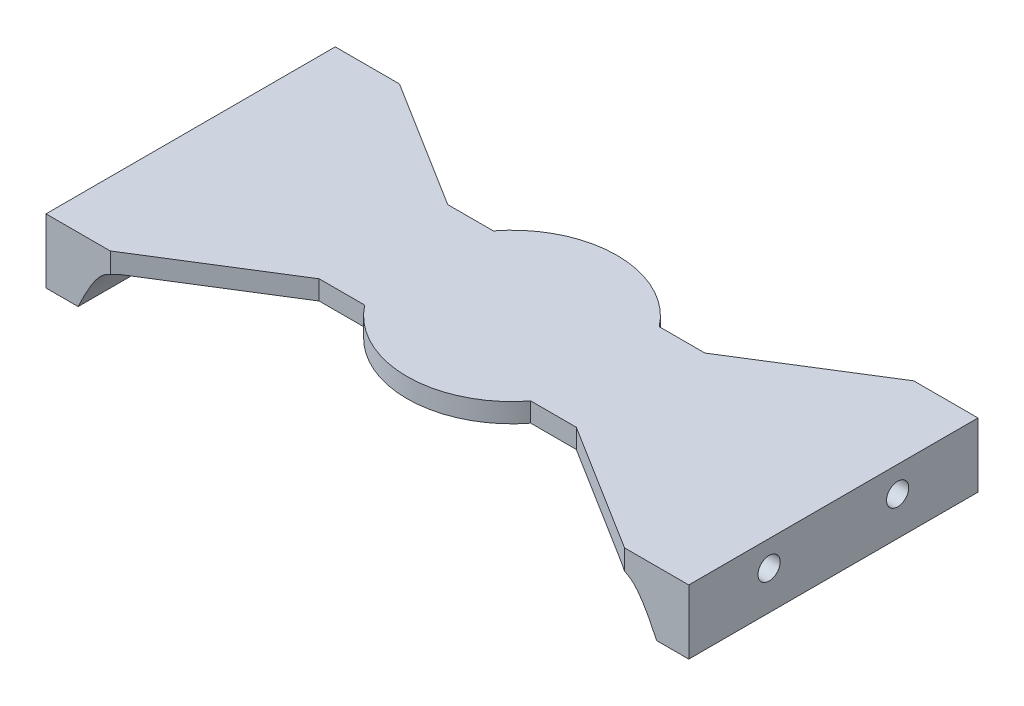
ISO-10303-21;
HEADER;
FILE_DESCRIPTION(('STEP AP214'),'2;1');
FILE_NAME('part.step','',(''),(''),'','','');
FILE_SCHEMA(('AUTOMOTIVE_DESIGN { 1 0 10303 214 1 1 1 1 }'));
ENDSEC;
DATA;
#1=APPLICATION_CONTEXT('core data for automotive mechanical design processes');
#2=APPLICATION_PROTOCOL_DEFINITION('international standard','automotive_design',2000,#1);
#3=PRODUCT_CONTEXT('',#1,'mechanical');
#4=PRODUCT('Part','Part','',(#3));
#5=PRODUCT_RELATED_PRODUCT_CATEGORY('part','',(#4));
#6=PRODUCT_DEFINITION_FORMATION('','',#4);
#7=PRODUCT_DEFINITION_CONTEXT('part definition',#1,'design');
#8=PRODUCT_DEFINITION('design','',#6,#7);
#9=PRODUCT_DEFINITION_SHAPE('','',#8);
#10=(LENGTH_UNIT() NAMED_UNIT(*) SI_UNIT(.MILLI.,.METRE.));
#11=(NAMED_UNIT(*) PLANE_ANGLE_UNIT() SI_UNIT($,.RADIAN.));
#12=(NAMED_UNIT(*) SI_UNIT($,.STERADIAN.) SOLID_ANGLE_UNIT());
#13=UNCERTAINTY_MEASURE_WITH_UNIT(LENGTH_MEASURE(1.E-05),#10,'distance_accuracy_value','');
#14=(GEOMETRIC_REPRESENTATION_CONTEXT(3) GLOBAL_UNCERTAINTY_ASSIGNED_CONTEXT((#13)) GLOBAL_UNIT_ASSIGNED_CONTEXT((#10,
#11,#12)) REPRESENTATION_CONTEXT('',''));
#15=CARTESIAN_POINT('',(0.,0.,0.));
#16=DIRECTION('',(0.,0.,1.));
#17=DIRECTION('',(1.,0.,0.));
#18=AXIS2_PLACEMENT_3D('',#15,#16,#17);
#19=CARTESIAN_POINT('',(20.,3.,9.99999999999999));
#20=DIRECTION('',(0.,0.,-1.));
#21=DIRECTION('',(-1.,0.,0.));
#22=AXIS2_PLACEMENT_3D('',#19,#20,#21);
#23=PLANE('',#22);
#24=DIRECTION('',(1.,0.,0.));
#25=VECTOR('',#24,1.);
#26=CARTESIAN_POINT('',(20.,0.,9.99999999999999));
#27=LINE('',#26,#25);
#28=CARTESIAN_POINT('',(-20.,0.,10.));
#29=VERTEX_POINT('',#28);
#30=CARTESIAN_POINT('',(-12.9126281933398,0.,10.));
#31=VERTEX_POINT('',#30);
#32=EDGE_CURVE('E67',#29,#31,#27,.T.);
#33=ORIENTED_EDGE('',*,*,#32,.T.);
#34=DIRECTION('',(0.,1.,0.));
#35=VECTOR('',#34,1.);
#36=CARTESIAN_POINT('',(-12.9126281933398,-46.1940227180474,10.));
#37=LINE('',#36,#35);
#38=CARTESIAN_POINT('',(-12.9126281933398,3.,10.));
#39=VERTEX_POINT('',#38);
#40=EDGE_CURVE('E223',#31,#39,#37,.T.);
#41=ORIENTED_EDGE('',*,*,#40,.T.);
#42=DIRECTION('',(1.,0.,0.));
#43=VECTOR('',#42,1.);
#44=CARTESIAN_POINT('',(20.,3.,9.99999999999999));
#45=LINE('',#44,#43);
#46=CARTESIAN_POINT('',(-20.,3.,10.));
#47=VERTEX_POINT('',#46);
#48=EDGE_CURVE('E270',#47,#39,#45,.T.);
#49=ORIENTED_EDGE('',*,*,#48,.F.);
#50=DIRECTION('',(0.,-1.,0.));
#51=VECTOR('',#50,1.);
#52=CARTESIAN_POINT('',(-20.,3.,10.));
#53=LINE('',#52,#51);
#54=EDGE_CURVE('E549',#47,#29,#53,.T.);
#55=ORIENTED_EDGE('',*,*,#54,.T.);
#56=EDGE_LOOP('',(#33,#41,#49,#55));
#57=FACE_BOUND('',#56,.T.);
#58=ADVANCED_FACE('F48',(#57),#23,.F.);
#59=CARTESIAN_POINT('',(20.,3.,-10.));
#60=DIRECTION('',(0.,0.,1.));
#61=DIRECTION('',(1.,0.,0.));
#62=AXIS2_PLACEMENT_3D('',#59,#60,#61);
#63=PLANE('',#62);
#64=DIRECTION('',(-1.,0.,0.));
#65=VECTOR('',#64,1.);
#66=CARTESIAN_POINT('',(20.,0.,-10.));
#67=LINE('',#66,#65);
#68=CARTESIAN_POINT('',(20.,0.,-10.));
#69=VERTEX_POINT('',#68);
#70=CARTESIAN_POINT('',(12.9126281933398,0.,-10.));
#71=VERTEX_POINT('',#70);
#72=EDGE_CURVE('E75',#69,#71,#67,.T.);
#73=ORIENTED_EDGE('',*,*,#72,.T.);
#74=DIRECTION('',(0.,1.,0.));
#75=VECTOR('',#74,1.);
#76=CARTESIAN_POINT('',(12.9126281933398,-46.1940227180474,-10.));
#77=LINE('',#76,#75);
#78=CARTESIAN_POINT('',(12.9126281933398,3.,-10.));
#79=VERTEX_POINT('',#78);
#80=EDGE_CURVE('E209',#71,#79,#77,.T.);
#81=ORIENTED_EDGE('',*,*,#80,.T.);
#82=DIRECTION('',(-1.,0.,0.));
#83=VECTOR('',#82,1.);
#84=CARTESIAN_POINT('',(20.,3.,-10.));
#85=LINE('',#84,#83);
#86=CARTESIAN_POINT('',(20.,3.,-10.));
#87=VERTEX_POINT('',#86);
#88=EDGE_CURVE('E283',#87,#79,#85,.T.);
#89=ORIENTED_EDGE('',*,*,#88,.F.);
#90=DIRECTION('',(0.,-1.,0.));
#91=VECTOR('',#90,1.);
#92=CARTESIAN_POINT('',(20.,3.,-10.));
#93=LINE('',#92,#91);
#94=EDGE_CURVE('E535',#87,#69,#93,.T.);
#95=ORIENTED_EDGE('',*,*,#94,.T.);
#96=EDGE_LOOP('',(#73,#81,#89,#95));
#97=FACE_BOUND('',#96,.T.);
#98=ADVANCED_FACE('F690',(#97),#63,.F.);
#99=CARTESIAN_POINT('',(50.,3.,-22.5));
#100=DIRECTION('',(-1.,0.,0.));
#101=DIRECTION('',(0.,0.,1.));
#102=AXIS2_PLACEMENT_3D('',#99,#100,#101);
#103=PLANE('',#102);
#104=CARTESIAN_POINT('',(50.,-1.,10.));
#105=DIRECTION('',(-1.,0.,0.));
#106=DIRECTION('',(0.,0.,1.));
#107=AXIS2_PLACEMENT_3D('',#104,#105,#106);
#108=CIRCLE('',#107,1.725);
#109=CARTESIAN_POINT('',(50.,-1.,11.725));
#110=VERTEX_POINT('',#109);
#111=EDGE_CURVE('E225',#110,#110,#108,.F.);
#112=ORIENTED_EDGE('',*,*,#111,.F.);
#113=EDGE_LOOP('',(#112));
#114=FACE_BOUND('',#113,.T.);
#115=DIRECTION('',(0.,-1.,0.));
#116=VECTOR('',#115,1.);
#117=CARTESIAN_POINT('',(50.,3.,22.5));
#118=LINE('',#117,#116);
#119=CARTESIAN_POINT('',(50.,3.,22.5));
#120=VERTEX_POINT('',#119);
#121=CARTESIAN_POINT('',(50.,-7.,22.5));
#122=VERTEX_POINT('',#121);
#123=EDGE_CURVE('E531',#120,#122,#118,.T.);
#124=ORIENTED_EDGE('',*,*,#123,.T.);
#125=DIRECTION('',(0.,0.,1.));
#126=VECTOR('',#125,1.);
#127=CARTESIAN_POINT('',(50.,-7.,0.));
#128=LINE('',#127,#126);
#129=CARTESIAN_POINT('',(50.,-7.,-22.5));
#130=VERTEX_POINT('',#129);
#131=EDGE_CURVE('E229',#130,#122,#128,.T.);
#132=ORIENTED_EDGE('',*,*,#131,.F.);
#133=DIRECTION('',(0.,-1.,0.));
#134=VECTOR('',#133,1.);
#135=CARTESIAN_POINT('',(50.,3.,-22.5));
#136=LINE('',#135,#134);
#137=CARTESIAN_POINT('',(50.,3.,-22.5));
#138=VERTEX_POINT('',#137);
#139=EDGE_CURVE('E534',#138,#130,#136,.T.);
#140=ORIENTED_EDGE('',*,*,#139,.F.);
#141=DIRECTION('',(0.,0.,-1.));
#142=VECTOR('',#141,1.);
#143=CARTESIAN_POINT('',(50.,3.,-22.5));
#144=LINE('',#143,#142);
#145=EDGE_CURVE('E277',#120,#138,#144,.T.);
#146=ORIENTED_EDGE('',*,*,#145,.F.);
#147=EDGE_LOOP('',(#124,#132,#140,#146));
#148=FACE_BOUND('',#147,.T.);
#149=CARTESIAN_POINT('',(50.,-1.,-9.99999999999999));
#150=DIRECTION('',(-1.,0.,0.));
#151=DIRECTION('',(0.,0.,1.));
#152=AXIS2_PLACEMENT_3D('',#149,#150,#151);
#153=CIRCLE('',#152,1.725);
#154=CARTESIAN_POINT('',(50.,-1.,-8.27499999999999));
#155=VERTEX_POINT('',#154);
#156=EDGE_CURVE('E230',#155,#155,#153,.T.);
#157=ORIENTED_EDGE('',*,*,#156,.T.);
#158=EDGE_LOOP('',(#157));
#159=FACE_BOUND('',#158,.T.);
#160=ADVANCED_FACE('F320',(#114,#148,#159),#103,.F.);
#161=CARTESIAN_POINT('',(0.,0.,0.));
#162=DIRECTION('',(0.,1.,0.));
#163=DIRECTION('',(0.,0.,1.));
#164=AXIS2_PLACEMENT_3D('',#161,#162,#163);
#165=PLANE('',#164);
#166=CARTESIAN_POINT('',(-12.9126281933398,0.,-10.));
#167=VERTEX_POINT('',#166);
#168=CARTESIAN_POINT('',(-20.,0.,-10.));
#169=VERTEX_POINT('',#168);
#170=EDGE_CURVE('E190',#167,#169,#67,.T.);
#171=ORIENTED_EDGE('',*,*,#170,.F.);
#172=CARTESIAN_POINT('',(0.,0.,0.));
#173=DIRECTION('',(0.,1.,0.));
#174=DIRECTION('',(0.,0.,1.));
#175=AXIS2_PLACEMENT_3D('',#172,#173,#174);
#176=CIRCLE('',#175,16.3320533571084);
#177=EDGE_CURVE('E194',#167,#71,#176,.F.);
#178=ORIENTED_EDGE('',*,*,#177,.T.);
#179=ORIENTED_EDGE('',*,*,#72,.F.);
#180=DIRECTION('',(-0.847998304005088,0.,0.52999894000318));
#181=VECTOR('',#180,1.);
#182=CARTESIAN_POINT('',(20.,0.,-10.));
#183=LINE('',#182,#181);
#184=CARTESIAN_POINT('',(38.6754446796632,0.,-21.6721529247895));
#185=VERTEX_POINT('',#184);
#186=EDGE_CURVE('E200',#185,#69,#183,.T.);
#187=ORIENTED_EDGE('',*,*,#186,.F.);
#188=CARTESIAN_POINT('',(38.6754446796632,0.,24.75));
#189=CARTESIAN_POINT('',(38.6754446796632,0.,8.25000000000001));
#190=CARTESIAN_POINT('',(38.6754446796632,0.,-8.25));
#191=CARTESIAN_POINT('',(38.6754446796632,0.,-24.75));
#192=B_SPLINE_CURVE_WITH_KNOTS('',3,(#188,#189,#190,#191),.UNSPECIFIED.,.F.,.F.,(4,4),(-0.02475,
0.02475),.UNSPECIFIED.);
#193=CARTESIAN_POINT('',(38.6754446796632,0.,21.6721529247895));
#194=VERTEX_POINT('',#193);
#195=EDGE_CURVE('E608',#185,#194,#192,.F.);
#196=ORIENTED_EDGE('',*,*,#195,.T.);
#197=DIRECTION('',(0.847998304005088,0.,0.52999894000318));
#198=VECTOR('',#197,1.);
#199=CARTESIAN_POINT('',(20.,0.,9.99999999999999));
#200=LINE('',#199,#198);
#201=CARTESIAN_POINT('',(20.,0.,9.99999999999999));
#202=VERTEX_POINT('',#201);
#203=EDGE_CURVE('E596',#202,#194,#200,.T.);
#204=ORIENTED_EDGE('',*,*,#203,.F.);
#205=CARTESIAN_POINT('',(12.9126281933398,0.,10.));
#206=VERTEX_POINT('',#205);
#207=EDGE_CURVE('E299',#206,#202,#27,.T.);
#208=ORIENTED_EDGE('',*,*,#207,.F.);
#209=EDGE_CURVE('E212',#206,#31,#176,.F.);
#210=ORIENTED_EDGE('',*,*,#209,.T.);
#211=ORIENTED_EDGE('',*,*,#32,.F.);
#212=DIRECTION('',(0.847998304005088,0.,-0.52999894000318));
#213=VECTOR('',#212,1.);
#214=CARTESIAN_POINT('',(-20.,0.,10.));
#215=LINE('',#214,#213);
#216=CARTESIAN_POINT('',(-38.6754446796632,0.,21.6721529247895));
#217=VERTEX_POINT('',#216);
#218=EDGE_CURVE('E294',#217,#29,#215,.T.);
#219=ORIENTED_EDGE('',*,*,#218,.F.);
#220=CARTESIAN_POINT('',(-38.6754446796632,0.,-24.75));
#221=CARTESIAN_POINT('',(-38.6754446796632,0.,-8.24999999999999));
#222=CARTESIAN_POINT('',(-38.6754446796632,0.,8.25000000000001));
#223=CARTESIAN_POINT('',(-38.6754446796632,0.,24.75));
#224=B_SPLINE_CURVE_WITH_KNOTS('',3,(#220,#221,#222,#223),.UNSPECIFIED.,.F.,.F.,(4,4),(-0.02475,
0.02475),.UNSPECIFIED.);
#225=CARTESIAN_POINT('',(-38.6754446796632,0.,-21.6721529247895));
#226=VERTEX_POINT('',#225);
#227=EDGE_CURVE('E303',#217,#226,#224,.F.);
#228=ORIENTED_EDGE('',*,*,#227,.T.);
#229=DIRECTION('',(-0.847998304005088,0.,-0.52999894000318));
#230=VECTOR('',#229,1.);
#231=CARTESIAN_POINT('',(-20.,0.,-10.));
#232=LINE('',#231,#230);
#233=EDGE_CURVE('E196',#169,#226,#232,.T.);
#234=ORIENTED_EDGE('',*,*,#233,.F.);
#235=EDGE_LOOP('',(#171,#178,#179,#187,#196,#204,#208,#210,#211,#219,#228,#234));
#236=FACE_BOUND('',#235,.T.);
#237=ADVANCED_FACE('F192',(#236),#165,.F.);
#238=CARTESIAN_POINT('',(-50.,3.,-22.5));
#239=DIRECTION('',(1.,0.,0.));
#240=DIRECTION('',(0.,0.,-1.));
#241=AXIS2_PLACEMENT_3D('',#238,#239,#240);
#242=PLANE('',#241);
#243=DIRECTION('',(0.,-1.,0.));
#244=VECTOR('',#243,1.);
#245=CARTESIAN_POINT('',(-50.,3.,-22.5));
#246=LINE('',#245,#244);
#247=CARTESIAN_POINT('',(-50.,3.,-22.5));
#248=VERTEX_POINT('',#247);
#249=CARTESIAN_POINT('',(-50.,-7.,-22.5));
#250=VERTEX_POINT('',#249);
#251=EDGE_CURVE('E296',#248,#250,#246,.T.);
#252=ORIENTED_EDGE('',*,*,#251,.T.);
#253=DIRECTION('',(0.,0.,1.));
#254=VECTOR('',#253,1.);
#255=CARTESIAN_POINT('',(-50.,-7.,0.));
#256=LINE('',#255,#254);
#257=CARTESIAN_POINT('',(-50.,-7.,22.5));
#258=VERTEX_POINT('',#257);
#259=EDGE_CURVE('E244',#250,#258,#256,.T.);
#260=ORIENTED_EDGE('',*,*,#259,.T.);
#261=DIRECTION('',(0.,-1.,0.));
#262=VECTOR('',#261,1.);
#263=CARTESIAN_POINT('',(-50.,3.,22.5));
#264=LINE('',#263,#262);
#265=CARTESIAN_POINT('',(-50.,3.,22.5));
#266=VERTEX_POINT('',#265);
#267=EDGE_CURVE('E550',#266,#258,#264,.T.);
#268=ORIENTED_EDGE('',*,*,#267,.F.);
#269=DIRECTION('',(0.,0.,1.));
#270=VECTOR('',#269,1.);
#271=CARTESIAN_POINT('',(-50.,3.,-22.5));
#272=LINE('',#271,#270);
#273=EDGE_CURVE('E263',#248,#266,#272,.T.);
#274=ORIENTED_EDGE('',*,*,#273,.F.);
#275=EDGE_LOOP('',(#252,#260,#268,#274));
#276=FACE_BOUND('',#275,.T.);
#277=CARTESIAN_POINT('',(-50.,-1.,10.));
#278=DIRECTION('',(-1.,0.,0.));
#279=DIRECTION('',(0.,0.,1.));
#280=AXIS2_PLACEMENT_3D('',#277,#278,#279);
#281=CIRCLE('',#280,1.725);
#282=CARTESIAN_POINT('',(-50.,-1.,11.725));
#283=VERTEX_POINT('',#282);
#284=EDGE_CURVE('E251',#283,#283,#281,.F.);
#285=ORIENTED_EDGE('',*,*,#284,.T.);
#286=EDGE_LOOP('',(#285));
#287=FACE_BOUND('',#286,.T.);
#288=CARTESIAN_POINT('',(-50.,-1.,-9.99999999999999));
#289=DIRECTION('',(-1.,0.,0.));
#290=DIRECTION('',(0.,0.,1.));
#291=AXIS2_PLACEMENT_3D('',#288,#289,#290);
#292=CIRCLE('',#291,1.725);
#293=CARTESIAN_POINT('',(-50.,-1.,-8.27499999999999));
#294=VERTEX_POINT('',#293);
#295=EDGE_CURVE('E245',#294,#294,#292,.T.);
#296=ORIENTED_EDGE('',*,*,#295,.F.);
#297=EDGE_LOOP('',(#296));
#298=FACE_BOUND('',#297,.T.);
#299=ADVANCED_FACE('F319',(#276,#287,#298),#242,.F.);
#300=CARTESIAN_POINT('',(-20.,3.,-10.));
#301=DIRECTION('',(-0.52999894000318,0.,0.847998304005088));
#302=DIRECTION('',(0.847998304005088,0.,0.52999894000318));
#303=AXIS2_PLACEMENT_3D('',#300,#301,#302);
#304=PLANE('',#303);
#305=ORIENTED_EDGE('',*,*,#233,.T.);
#306=CARTESIAN_POINT('',(-40.0000000000001,-0.174023072215505,-22.5));
#307=CARTESIAN_POINT('',(-39.9511052127495,-0.157124597354064,-22.4694445362634));
#308=CARTESIAN_POINT('',(-39.9018367739734,-0.141527336185102,-22.4387683814262));
#309=CARTESIAN_POINT('',(-39.8013797694117,-0.112567300866798,-22.376333427405));
#310=CARTESIAN_POINT('',(-39.7501750960686,-0.0992754651749175,-22.3445676191217));
#311=CARTESIAN_POINT('',(-39.6460209080509,-0.0751686642259326,-22.2799480997207));
#312=CARTESIAN_POINT('',(-39.5930597490474,-0.0644238269324965,-22.2470870285744));
#313=CARTESIAN_POINT('',(-39.4855482466058,-0.0455213647415982,-22.1802777437784));
#314=CARTESIAN_POINT('',(-39.4309903485743,-0.0374322819956943,-22.1463224079821));
#315=CARTESIAN_POINT('',(-39.3203929810517,-0.0238084570783117,-22.0773225754087));
#316=CARTESIAN_POINT('',(-39.2643495302256,-0.0183400668790122,-22.0422715689899));
#317=CARTESIAN_POINT('',(-39.1508003934218,-0.00972987617742285,-21.9710788111913));
#318=CARTESIAN_POINT('',(-39.0932934460123,-0.00665017276787983,-21.9349318303717));
#319=CARTESIAN_POINT('',(-38.9767041807487,-0.00236627654956633,-21.861538271778));
#320=CARTESIAN_POINT('',(-38.9176220220249,-0.00121597924425783,-21.8242887868701));
#321=CARTESIAN_POINT('',(-38.7975331353893,2.8095629424175E-06,-21.7486944386895));
#322=CARTESIAN_POINT('',(-38.7365244037665,3.60854025650574E-05,-21.7103520289778));
#323=CARTESIAN_POINT('',(-38.6754446796632,0.,-21.6721529247895));
#324=B_SPLINE_CURVE_WITH_KNOTS('',3,(#306,#307,#308,#309,#310,#311,#312,#313,#314,#315,#316,
#317,#318,#319,#320,#321,#322,#323),.UNSPECIFIED.,.F.,.F.,(4,2,2,2,2,2,2,2,4),(0.,
0.180231524739219,0.36528454312453,0.554957925127218,0.749199358277534,0.948128220442263,
1.15206966075092,1.36161848698123,1.57776762867678),.UNSPECIFIED.);
#325=CARTESIAN_POINT('',(-40.,-0.174023072215511,-22.5));
#326=VERTEX_POINT('',#325);
#327=EDGE_CURVE('E390',#226,#326,#324,.F.);
#328=ORIENTED_EDGE('',*,*,#327,.T.);
#329=DIRECTION('',(0.,-1.,0.));
#330=VECTOR('',#329,1.);
#331=CARTESIAN_POINT('',(-40.,3.,-22.5));
#332=LINE('',#331,#330);
#333=CARTESIAN_POINT('',(-40.,3.,-22.5));
#334=VERTEX_POINT('',#333);
#335=EDGE_CURVE('E555',#334,#326,#332,.T.);
#336=ORIENTED_EDGE('',*,*,#335,.F.);
#337=DIRECTION('',(-0.847998304005088,0.,-0.52999894000318));
#338=VECTOR('',#337,1.);
#339=CARTESIAN_POINT('',(-20.,3.,-10.));
#340=LINE('',#339,#338);
#341=CARTESIAN_POINT('',(-20.,3.,-10.));
#342=VERTEX_POINT('',#341);
#343=EDGE_CURVE('E258',#342,#334,#340,.T.);
#344=ORIENTED_EDGE('',*,*,#343,.F.);
#345=DIRECTION('',(0.,-1.,0.));
#346=VECTOR('',#345,1.);
#347=CARTESIAN_POINT('',(-20.,3.,-10.));
#348=LINE('',#347,#346);
#349=EDGE_CURVE('E286',#342,#169,#348,.T.);
#350=ORIENTED_EDGE('',*,*,#349,.T.);
#351=EDGE_LOOP('',(#305,#328,#336,#344,#350));
#352=FACE_BOUND('',#351,.T.);
#353=ADVANCED_FACE('F397',(#352),#304,.F.);
#354=CARTESIAN_POINT('',(-40.,3.,-22.5));
#355=DIRECTION('',(0.,0.,1.));
#356=DIRECTION('',(1.,0.,0.));
#357=AXIS2_PLACEMENT_3D('',#354,#355,#356);
#358=PLANE('',#357);
#359=ORIENTED_EDGE('',*,*,#335,.T.);
#360=CARTESIAN_POINT('',(-45.,-7.,-22.5));
#361=CARTESIAN_POINT('',(-44.4087744832353,-5.75358717080906,-22.5));
#362=CARTESIAN_POINT('',(-43.8175489664707,-4.50717434161812,-22.5));
#363=CARTESIAN_POINT('',(-42.4100755832647,-1.89686037957567,-22.5));
#364=CARTESIAN_POINT('',(-41.0526530374568,-0.394468932369628,-22.5));
#365=CARTESIAN_POINT('',(-39.7452813290469,0.,-22.5));
#366=CARTESIAN_POINT('',(-39.2103630043551,0.,-22.5));
#367=CARTESIAN_POINT('',(-38.6754446796632,0.,-22.5));
#368=B_SPLINE_CURVE_WITH_KNOTS('',5,(#360,#361,#362,#363,#364,#365,#366,#367),.UNSPECIFIED.,.F.,
.F.,(6,2,6),(0.,0.5,1.),.UNSPECIFIED.);
#369=CARTESIAN_POINT('',(-45.,-7.,-22.5));
#370=VERTEX_POINT('',#369);
#371=EDGE_CURVE('E612',#326,#370,#368,.F.);
#372=ORIENTED_EDGE('',*,*,#371,.T.);
#373=DIRECTION('',(-1.,0.,0.));
#374=VECTOR('',#373,1.);
#375=CARTESIAN_POINT('',(-45.,-7.,-22.5));
#376=LINE('',#375,#374);
#377=EDGE_CURVE('E565',#370,#250,#376,.T.);
#378=ORIENTED_EDGE('',*,*,#377,.T.);
#379=ORIENTED_EDGE('',*,*,#251,.F.);
#380=DIRECTION('',(-1.,0.,0.));
#381=VECTOR('',#380,1.);
#382=CARTESIAN_POINT('',(-40.,3.,-22.5));
#383=LINE('',#382,#381);
#384=EDGE_CURVE('E261',#334,#248,#383,.T.);
#385=ORIENTED_EDGE('',*,*,#384,.F.);
#386=EDGE_LOOP('',(#359,#372,#378,#379,#385));
#387=FACE_BOUND('',#386,.T.);
#388=ADVANCED_FACE('F406',(#387),#358,.F.);
#389=CARTESIAN_POINT('',(-40.,3.,22.5));
#390=DIRECTION('',(0.,0.,-1.));
#391=DIRECTION('',(-1.,0.,0.));
#392=AXIS2_PLACEMENT_3D('',#389,#390,#391);
#393=PLANE('',#392);
#394=ORIENTED_EDGE('',*,*,#267,.T.);
#395=DIRECTION('',(-1.,0.,0.));
#396=VECTOR('',#395,1.);
#397=CARTESIAN_POINT('',(-45.,-7.,22.5));
#398=LINE('',#397,#396);
#399=CARTESIAN_POINT('',(-45.,-7.,22.5));
#400=VERTEX_POINT('',#399);
#401=EDGE_CURVE('E295',#400,#258,#398,.T.);
#402=ORIENTED_EDGE('',*,*,#401,.F.);
#403=CARTESIAN_POINT('',(-38.6754446796632,0.,22.5));
#404=CARTESIAN_POINT('',(-39.2103630043551,0.,22.5));
#405=CARTESIAN_POINT('',(-39.7452813290469,0.,22.5));
#406=CARTESIAN_POINT('',(-41.0526530374568,-0.394468932369628,22.5));
#407=CARTESIAN_POINT('',(-42.4100755832647,-1.89686037957567,22.5));
#408=CARTESIAN_POINT('',(-43.8175489664707,-4.50717434161812,22.5));
#409=CARTESIAN_POINT('',(-44.4087744832353,-5.75358717080906,22.5));
#410=CARTESIAN_POINT('',(-45.,-7.,22.5));
#411=B_SPLINE_CURVE_WITH_KNOTS('',5,(#403,#404,#405,#406,#407,#408,#409,#410),.UNSPECIFIED.,.F.,
.F.,(6,2,6),(0.,0.5,1.),.UNSPECIFIED.);
#412=CARTESIAN_POINT('',(-40.,-0.174023072215472,22.5));
#413=VERTEX_POINT('',#412);
#414=EDGE_CURVE('E561',#400,#413,#411,.F.);
#415=ORIENTED_EDGE('',*,*,#414,.T.);
#416=DIRECTION('',(0.,-1.,0.));
#417=VECTOR('',#416,1.);
#418=CARTESIAN_POINT('',(-40.,3.,22.5));
#419=LINE('',#418,#417);
#420=CARTESIAN_POINT('',(-40.,3.,22.5));
#421=VERTEX_POINT('',#420);
#422=EDGE_CURVE('E484',#421,#413,#419,.T.);
#423=ORIENTED_EDGE('',*,*,#422,.F.);
#424=DIRECTION('',(1.,0.,0.));
#425=VECTOR('',#424,1.);
#426=CARTESIAN_POINT('',(-40.,3.,22.5));
#427=LINE('',#426,#425);
#428=EDGE_CURVE('E265',#266,#421,#427,.T.);
#429=ORIENTED_EDGE('',*,*,#428,.F.);
#430=EDGE_LOOP('',(#394,#402,#415,#423,#429));
#431=FACE_BOUND('',#430,.T.);
#432=ADVANCED_FACE('F370',(#431),#393,.F.);
#433=CARTESIAN_POINT('',(-20.,3.,10.));
#434=DIRECTION('',(-0.52999894000318,0.,-0.847998304005088));
#435=DIRECTION('',(-0.847998304005088,0.,0.52999894000318));
#436=AXIS2_PLACEMENT_3D('',#433,#434,#435);
#437=PLANE('',#436);
#438=ORIENTED_EDGE('',*,*,#422,.T.);
#439=CARTESIAN_POINT('',(-38.6754446796632,0.,21.6721529247895));
#440=CARTESIAN_POINT('',(-38.7365244037665,3.60854025648683E-05,21.7103520289778));
#441=CARTESIAN_POINT('',(-38.7975331353893,2.80956294233247E-06,21.7486944386895));
#442=CARTESIAN_POINT('',(-38.9176220220249,-0.00121597924425766,21.8242887868701));
#443=CARTESIAN_POINT('',(-38.9767041807487,-0.00236627654956597,21.861538271778));
#444=CARTESIAN_POINT('',(-39.0932934460123,-0.00665017276787921,21.9349318303717));
#445=CARTESIAN_POINT('',(-39.1508003934218,-0.0097298761774219,21.9710788111913));
#446=CARTESIAN_POINT('',(-39.2643495302256,-0.0183400668790102,22.0422715689899));
#447=CARTESIAN_POINT('',(-39.3203929810517,-0.023808457078309,22.0773225754087));
#448=CARTESIAN_POINT('',(-39.4309903485743,-0.0374322819956896,22.1463224079821));
#449=CARTESIAN_POINT('',(-39.4855482466057,-0.0455213647415924,22.1802777437784));
#450=CARTESIAN_POINT('',(-39.5930597490474,-0.0644238269324866,22.2470870285744));
#451=CARTESIAN_POINT('',(-39.6460209080508,-0.0751686642259199,22.2799480997207));
#452=CARTESIAN_POINT('',(-39.7501750960686,-0.0992754651748988,22.3445676191217));
#453=CARTESIAN_POINT('',(-39.8013797694116,-0.112567300866776,22.376333427405));
#454=CARTESIAN_POINT('',(-39.9018367739734,-0.141527336185072,22.4387683814261));
#455=CARTESIAN_POINT('',(-39.9511052127494,-0.157124597354029,22.4694445362634));
#456=CARTESIAN_POINT('',(-40.,-0.174023072215467,22.5));
#457=B_SPLINE_CURVE_WITH_KNOTS('',3,(#439,#440,#441,#442,#443,#444,#445,#446,#447,#448,#449,
#450,#451,#452,#453,#454,#455,#456),.UNSPECIFIED.,.F.,.F.,(4,2,2,2,2,2,2,2,4),(0.,
0.216149141695557,0.425697967925866,0.629639408234498,0.828568270399202,1.0228097035495,
1.21248308555218,1.39753610393746,1.57776762867663),.UNSPECIFIED.);
#458=EDGE_CURVE('E559',#413,#217,#457,.F.);
#459=ORIENTED_EDGE('',*,*,#458,.T.);
#460=ORIENTED_EDGE('',*,*,#218,.T.);
#461=ORIENTED_EDGE('',*,*,#54,.F.);
#462=DIRECTION('',(0.847998304005088,0.,-0.52999894000318));
#463=VECTOR('',#462,1.);
#464=CARTESIAN_POINT('',(-20.,3.,10.));
#465=LINE('',#464,#463);
#466=EDGE_CURVE('E267',#421,#47,#465,.T.);
#467=ORIENTED_EDGE('',*,*,#466,.F.);
#468=EDGE_LOOP('',(#438,#459,#460,#461,#467));
#469=FACE_BOUND('',#468,.T.);
#470=ADVANCED_FACE('F365',(#469),#437,.F.);
#471=CARTESIAN_POINT('',(12.9126281933398,3.,10.));
#472=VERTEX_POINT('',#471);
#473=CARTESIAN_POINT('',(20.,3.,9.99999999999999));
#474=VERTEX_POINT('',#473);
#475=EDGE_CURVE('E269',#472,#474,#45,.T.);
#476=ORIENTED_EDGE('',*,*,#475,.F.);
#477=DIRECTION('',(0.,1.,0.));
#478=VECTOR('',#477,1.);
#479=CARTESIAN_POINT('',(12.9126281933398,-46.1940227180474,10.));
#480=LINE('',#479,#478);
#481=EDGE_CURVE('E220',#472,#206,#480,.F.);
#482=ORIENTED_EDGE('',*,*,#481,.T.);
#483=ORIENTED_EDGE('',*,*,#207,.T.);
#484=DIRECTION('',(0.,-1.,0.));
#485=VECTOR('',#484,1.);
#486=CARTESIAN_POINT('',(20.,3.,9.99999999999999));
#487=LINE('',#486,#485);
#488=EDGE_CURVE('E530',#474,#202,#487,.T.);
#489=ORIENTED_EDGE('',*,*,#488,.F.);
#490=EDGE_LOOP('',(#476,#482,#483,#489));
#491=FACE_BOUND('',#490,.T.);
#492=ADVANCED_FACE('F360',(#491),#23,.F.);
#493=CARTESIAN_POINT('',(20.,3.,9.99999999999999));
#494=DIRECTION('',(0.52999894000318,0.,-0.847998304005088));
#495=DIRECTION('',(-0.847998304005088,0.,-0.52999894000318));
#496=AXIS2_PLACEMENT_3D('',#493,#494,#495);
#497=PLANE('',#496);
#498=ORIENTED_EDGE('',*,*,#203,.T.);
#499=CARTESIAN_POINT('',(40.0000000000001,-0.174023072215498,22.5));
#500=CARTESIAN_POINT('',(39.9511052127495,-0.157124597354052,22.4694445362634));
#501=CARTESIAN_POINT('',(39.9018367739734,-0.141527336185088,22.4387683814262));
#502=CARTESIAN_POINT('',(39.8013797694116,-0.112567300866782,22.376333427405));
#503=CARTESIAN_POINT('',(39.7501750960686,-0.0992754651749012,22.3445676191217));
#504=CARTESIAN_POINT('',(39.6460209080508,-0.0751686642259171,22.2799480997207));
#505=CARTESIAN_POINT('',(39.5930597490473,-0.0644238269324815,22.2470870285743));
#506=CARTESIAN_POINT('',(39.4855482466057,-0.0455213647415855,22.1802777437783));
#507=CARTESIAN_POINT('',(39.4309903485742,-0.0374322819956832,22.1463224079821));
#508=CARTESIAN_POINT('',(39.3203929810516,-0.023808457078304,22.0773225754086));
#509=CARTESIAN_POINT('',(39.2643495302255,-0.0183400668790058,22.0422715689898));
#510=CARTESIAN_POINT('',(39.1508003934217,-0.00972987617741912,21.9710788111913));
#511=CARTESIAN_POINT('',(39.0932934460123,-0.00665017276787702,21.9349318303716));
#512=CARTESIAN_POINT('',(38.9767041807487,-0.00236627654956484,21.8615382717779));
#513=CARTESIAN_POINT('',(38.9176220220249,-0.00121597924425704,21.8242887868701));
#514=CARTESIAN_POINT('',(38.7975331353893,2.8095629421834E-06,21.7486944386894));
#515=CARTESIAN_POINT('',(38.7365244037665,3.60854025646155E-05,21.7103520289778));
#516=CARTESIAN_POINT('',(38.6754446796632,0.,21.6721529247895));
#517=B_SPLINE_CURVE_WITH_KNOTS('',3,(#499,#500,#501,#502,#503,#504,#505,#506,#507,#508,#509,
#510,#511,#512,#513,#514,#515,#516),.UNSPECIFIED.,.F.,.F.,(4,2,2,2,2,2,2,2,4),(0.,
0.180231524739235,0.365284543124571,0.554957925127271,0.749199358277595,0.948128220442312,
1.15206966075093,1.36161848698122,1.57776762867674),.UNSPECIFIED.);
#518=CARTESIAN_POINT('',(40.,-0.174023072215512,22.5));
#519=VERTEX_POINT('',#518);
#520=EDGE_CURVE('E342',#194,#519,#517,.F.);
#521=ORIENTED_EDGE('',*,*,#520,.T.);
#522=DIRECTION('',(0.,-1.,0.));
#523=VECTOR('',#522,1.);
#524=CARTESIAN_POINT('',(40.,3.,22.5));
#525=LINE('',#524,#523);
#526=CARTESIAN_POINT('',(40.,3.,22.5));
#527=VERTEX_POINT('',#526);
#528=EDGE_CURVE('E523',#527,#519,#525,.T.);
#529=ORIENTED_EDGE('',*,*,#528,.F.);
#530=DIRECTION('',(0.847998304005088,0.,0.52999894000318));
#531=VECTOR('',#530,1.);
#532=CARTESIAN_POINT('',(20.,3.,9.99999999999999));
#533=LINE('',#532,#531);
#534=EDGE_CURVE('E273',#474,#527,#533,.T.);
#535=ORIENTED_EDGE('',*,*,#534,.F.);
#536=ORIENTED_EDGE('',*,*,#488,.T.);
#537=EDGE_LOOP('',(#498,#521,#529,#535,#536));
#538=FACE_BOUND('',#537,.T.);
#539=ADVANCED_FACE('F349',(#538),#497,.F.);
#540=CARTESIAN_POINT('',(40.,3.,22.5));
#541=DIRECTION('',(0.,0.,-1.));
#542=DIRECTION('',(-1.,0.,0.));
#543=AXIS2_PLACEMENT_3D('',#540,#541,#542);
#544=PLANE('',#543);
#545=ORIENTED_EDGE('',*,*,#528,.T.);
#546=CARTESIAN_POINT('',(45.,-7.,22.5));
#547=CARTESIAN_POINT('',(44.4087744832353,-5.75358717080906,22.5));
#548=CARTESIAN_POINT('',(43.8175489664707,-4.50717434161812,22.5));
#549=CARTESIAN_POINT('',(42.4100755832647,-1.89686037957567,22.5));
#550=CARTESIAN_POINT('',(41.0526530374568,-0.39446893236963,22.5));
#551=CARTESIAN_POINT('',(39.7452813290469,0.,22.5));
#552=CARTESIAN_POINT('',(39.2103630043551,0.,22.5));
#553=CARTESIAN_POINT('',(38.6754446796632,0.,22.5));
#554=B_SPLINE_CURVE_WITH_KNOTS('',5,(#546,#547,#548,#549,#550,#551,#552,#553),.UNSPECIFIED.,.F.,
.F.,(6,2,6),(0.,0.5,1.),.UNSPECIFIED.);
#555=CARTESIAN_POINT('',(45.,-7.,22.5));
#556=VERTEX_POINT('',#555);
#557=EDGE_CURVE('E613',#519,#556,#554,.F.);
#558=ORIENTED_EDGE('',*,*,#557,.T.);
#559=DIRECTION('',(1.,0.,0.));
#560=VECTOR('',#559,1.);
#561=CARTESIAN_POINT('',(45.,-7.,22.5));
#562=LINE('',#561,#560);
#563=EDGE_CURVE('E657',#556,#122,#562,.T.);
#564=ORIENTED_EDGE('',*,*,#563,.T.);
#565=ORIENTED_EDGE('',*,*,#123,.F.);
#566=DIRECTION('',(1.,0.,0.));
#567=VECTOR('',#566,1.);
#568=CARTESIAN_POINT('',(40.,3.,22.5));
#569=LINE('',#568,#567);
#570=EDGE_CURVE('E275',#527,#120,#569,.T.);
#571=ORIENTED_EDGE('',*,*,#570,.F.);
#572=EDGE_LOOP('',(#545,#558,#564,#565,#571));
#573=FACE_BOUND('',#572,.T.);
#574=ADVANCED_FACE('F359',(#573),#544,.F.);
#575=CARTESIAN_POINT('',(40.,3.,-22.5));
#576=DIRECTION('',(0.,0.,1.));
#577=DIRECTION('',(1.,0.,0.));
#578=AXIS2_PLACEMENT_3D('',#575,#576,#577);
#579=PLANE('',#578);
#580=ORIENTED_EDGE('',*,*,#139,.T.);
#581=DIRECTION('',(1.,0.,0.));
#582=VECTOR('',#581,1.);
#583=CARTESIAN_POINT('',(45.,-7.,-22.5));
#584=LINE('',#583,#582);
#585=CARTESIAN_POINT('',(45.,-7.,-22.5));
#586=VERTEX_POINT('',#585);
#587=EDGE_CURVE('E254',#586,#130,#584,.T.);
#588=ORIENTED_EDGE('',*,*,#587,.F.);
#589=CARTESIAN_POINT('',(38.6754446796632,0.,-22.5));
#590=CARTESIAN_POINT('',(39.2103630043551,0.,-22.5));
#591=CARTESIAN_POINT('',(39.7452813290469,0.,-22.5));
#592=CARTESIAN_POINT('',(41.0526530374568,-0.39446893236963,-22.5));
#593=CARTESIAN_POINT('',(42.4100755832647,-1.89686037957567,-22.5));
#594=CARTESIAN_POINT('',(43.8175489664707,-4.50717434161812,-22.5));
#595=CARTESIAN_POINT('',(44.4087744832353,-5.75358717080906,-22.5));
#596=CARTESIAN_POINT('',(45.,-7.,-22.5));
#597=B_SPLINE_CURVE_WITH_KNOTS('',5,(#589,#590,#591,#592,#593,#594,#595,#596),.UNSPECIFIED.,.F.,
.F.,(6,2,6),(0.,0.5,1.),.UNSPECIFIED.);
#598=CARTESIAN_POINT('',(40.,-0.174023072215476,-22.5));
#599=VERTEX_POINT('',#598);
#600=EDGE_CURVE('E60',#586,#599,#597,.F.);
#601=ORIENTED_EDGE('',*,*,#600,.T.);
#602=DIRECTION('',(0.,-1.,0.));
#603=VECTOR('',#602,1.);
#604=CARTESIAN_POINT('',(40.,3.,-22.5));
#605=LINE('',#604,#603);
#606=CARTESIAN_POINT('',(40.,3.,-22.5));
#607=VERTEX_POINT('',#606);
#608=EDGE_CURVE('E533',#607,#599,#605,.T.);
#609=ORIENTED_EDGE('',*,*,#608,.F.);
#610=DIRECTION('',(-1.,0.,0.));
#611=VECTOR('',#610,1.);
#612=CARTESIAN_POINT('',(40.,3.,-22.5));
#613=LINE('',#612,#611);
#614=EDGE_CURVE('E279',#138,#607,#613,.T.);
#615=ORIENTED_EDGE('',*,*,#614,.F.);
#616=EDGE_LOOP('',(#580,#588,#601,#609,#615));
#617=FACE_BOUND('',#616,.T.);
#618=ADVANCED_FACE('F620',(#617),#579,.F.);
#619=CARTESIAN_POINT('',(20.,3.,-10.));
#620=DIRECTION('',(0.52999894000318,0.,0.847998304005088));
#621=DIRECTION('',(0.847998304005088,0.,-0.52999894000318));
#622=AXIS2_PLACEMENT_3D('',#619,#620,#621);
#623=PLANE('',#622);
#624=ORIENTED_EDGE('',*,*,#608,.T.);
#625=CARTESIAN_POINT('',(38.6754446796632,0.,-21.6721529247895));
#626=CARTESIAN_POINT('',(38.7365244037665,3.60854025646757E-05,-21.7103520289778));
#627=CARTESIAN_POINT('',(38.7975331353893,2.80956294221347E-06,-21.7486944386895));
#628=CARTESIAN_POINT('',(38.9176220220249,-0.00121597924425741,-21.8242887868701));
#629=CARTESIAN_POINT('',(38.9767041807487,-0.0023662765495655,-21.861538271778));
#630=CARTESIAN_POINT('',(39.0932934460123,-0.00665017276787848,-21.9349318303717));
#631=CARTESIAN_POINT('',(39.1508003934218,-0.00972987617742107,-21.9710788111913));
#632=CARTESIAN_POINT('',(39.2643495302256,-0.0183400668790089,-22.0422715689899));
#633=CARTESIAN_POINT('',(39.3203929810516,-0.0238084570783076,-22.0773225754086));
#634=CARTESIAN_POINT('',(39.4309903485743,-0.0374322819956876,-22.1463224079821));
#635=CARTESIAN_POINT('',(39.4855482466057,-0.0455213647415902,-22.1802777437784));
#636=CARTESIAN_POINT('',(39.5930597490474,-0.0644238269324847,-22.2470870285743));
#637=CARTESIAN_POINT('',(39.6460209080508,-0.0751686642259184,-22.2799480997207));
#638=CARTESIAN_POINT('',(39.7501750960686,-0.0992754651749,-22.3445676191217));
#639=CARTESIAN_POINT('',(39.8013797694116,-0.112567300866779,-22.376333427405));
#640=CARTESIAN_POINT('',(39.9018367739734,-0.14152733618508,-22.4387683814261));
#641=CARTESIAN_POINT('',(39.9511052127494,-0.157124597354041,-22.4694445362634));
#642=CARTESIAN_POINT('',(40.,-0.174023072215478,-22.5));
#643=B_SPLINE_CURVE_WITH_KNOTS('',3,(#625,#626,#627,#628,#629,#630,#631,#632,#633,#634,#635,
#636,#637,#638,#639,#640,#641,#642),.UNSPECIFIED.,.F.,.F.,(4,2,2,2,2,2,2,2,4),(0.,
0.216149141695541,0.425697967925847,0.629639408234468,0.828568270399179,1.02280970354949,
1.21248308555218,1.39753610393747,1.57776762867668),.UNSPECIFIED.);
#644=EDGE_CURVE('E12',#599,#185,#643,.F.);
#645=ORIENTED_EDGE('',*,*,#644,.T.);
#646=ORIENTED_EDGE('',*,*,#186,.T.);
#647=ORIENTED_EDGE('',*,*,#94,.F.);
#648=DIRECTION('',(-0.847998304005088,0.,0.52999894000318));
#649=VECTOR('',#648,1.);
#650=CARTESIAN_POINT('',(20.,3.,-10.));
#651=LINE('',#650,#649);
#652=EDGE_CURVE('E281',#607,#87,#651,.T.);
#653=ORIENTED_EDGE('',*,*,#652,.F.);
#654=EDGE_LOOP('',(#624,#645,#646,#647,#653));
#655=FACE_BOUND('',#654,.T.);
#656=ADVANCED_FACE('F679',(#655),#623,.F.);
#657=CARTESIAN_POINT('',(-12.9126281933398,3.,-10.));
#658=VERTEX_POINT('',#657);
#659=EDGE_CURVE('E205',#658,#342,#85,.T.);
#660=ORIENTED_EDGE('',*,*,#659,.F.);
#661=DIRECTION('',(0.,1.,0.));
#662=VECTOR('',#661,1.);
#663=CARTESIAN_POINT('',(-12.9126281933398,-46.1940227180474,-10.));
#664=LINE('',#663,#662);
#665=EDGE_CURVE('E203',#658,#167,#664,.F.);
#666=ORIENTED_EDGE('',*,*,#665,.T.);
#667=ORIENTED_EDGE('',*,*,#170,.T.);
#668=ORIENTED_EDGE('',*,*,#349,.F.);
#669=EDGE_LOOP('',(#660,#666,#667,#668));
#670=FACE_BOUND('',#669,.T.);
#671=ADVANCED_FACE('F204',(#670),#63,.F.);
#672=CARTESIAN_POINT('',(0.,3.,0.));
#673=DIRECTION('',(0.,1.,0.));
#674=DIRECTION('',(0.,0.,1.));
#675=AXIS2_PLACEMENT_3D('',#672,#673,#674);
#676=PLANE('',#675);
#677=ORIENTED_EDGE('',*,*,#48,.T.);
#678=CARTESIAN_POINT('',(0.,3.,0.));
#679=DIRECTION('',(0.,1.,0.));
#680=DIRECTION('',(0.,0.,1.));
#681=AXIS2_PLACEMENT_3D('',#678,#679,#680);
#682=CIRCLE('',#681,16.3320533571084);
#683=EDGE_CURVE('E217',#39,#472,#682,.T.);
#684=ORIENTED_EDGE('',*,*,#683,.T.);
#685=ORIENTED_EDGE('',*,*,#475,.T.);
#686=ORIENTED_EDGE('',*,*,#534,.T.);
#687=ORIENTED_EDGE('',*,*,#570,.T.);
#688=ORIENTED_EDGE('',*,*,#145,.T.);
#689=ORIENTED_EDGE('',*,*,#614,.T.);
#690=ORIENTED_EDGE('',*,*,#652,.T.);
#691=ORIENTED_EDGE('',*,*,#88,.T.);
#692=EDGE_CURVE('E215',#79,#658,#682,.T.);
#693=ORIENTED_EDGE('',*,*,#692,.T.);
#694=ORIENTED_EDGE('',*,*,#659,.T.);
#695=ORIENTED_EDGE('',*,*,#343,.T.);
#696=ORIENTED_EDGE('',*,*,#384,.T.);
#697=ORIENTED_EDGE('',*,*,#273,.T.);
#698=ORIENTED_EDGE('',*,*,#428,.T.);
#699=ORIENTED_EDGE('',*,*,#466,.T.);
#700=EDGE_LOOP('',(#677,#684,#685,#686,#687,#688,#689,#690,#691,#693,#694,#695,#696,#697,#698,#699));
#701=FACE_BOUND('',#700,.T.);
#702=ADVANCED_FACE('F321',(#701),#676,.T.);
#703=CARTESIAN_POINT('',(-45.,-7.,0.));
#704=DIRECTION('',(0.,-1.,0.));
#705=DIRECTION('',(0.,0.,-1.));
#706=AXIS2_PLACEMENT_3D('',#703,#704,#705);
#707=PLANE('',#706);
#708=ORIENTED_EDGE('',*,*,#259,.F.);
#709=ORIENTED_EDGE('',*,*,#377,.F.);
#710=CARTESIAN_POINT('',(-45.,-7.,24.75));
#711=CARTESIAN_POINT('',(-45.,-7.,8.25000000000001));
#712=CARTESIAN_POINT('',(-45.,-7.,-8.24999999999999));
#713=CARTESIAN_POINT('',(-45.,-7.,-24.75));
#714=B_SPLINE_CURVE_WITH_KNOTS('',3,(#710,#711,#712,#713),.UNSPECIFIED.,.F.,.F.,(4,4),(-0.02475,
0.02475),.UNSPECIFIED.);
#715=EDGE_CURVE('E257',#370,#400,#714,.F.);
#716=ORIENTED_EDGE('',*,*,#715,.T.);
#717=ORIENTED_EDGE('',*,*,#401,.T.);
#718=EDGE_LOOP('',(#708,#709,#716,#717));
#719=FACE_BOUND('',#718,.T.);
#720=ADVANCED_FACE('F417',(#719),#707,.T.);
#721=CARTESIAN_POINT('',(-38.6754446796632,0.,24.75));
#722=CARTESIAN_POINT('',(-38.6754446796632,0.,8.25000000000001));
#723=CARTESIAN_POINT('',(-38.6754446796632,0.,-8.24999999999999));
#724=CARTESIAN_POINT('',(-38.6754446796632,0.,-24.75));
#725=CARTESIAN_POINT('',(-39.2103630043551,0.,24.75));
#726=CARTESIAN_POINT('',(-39.2103630043551,0.,8.25000000000001));
#727=CARTESIAN_POINT('',(-39.2103630043551,0.,-8.24999999999999));
#728=CARTESIAN_POINT('',(-39.2103630043551,0.,-24.75));
#729=CARTESIAN_POINT('',(-39.7452813290469,0.,24.75));
#730=CARTESIAN_POINT('',(-39.7452813290469,0.,8.25000000000001));
#731=CARTESIAN_POINT('',(-39.7452813290469,0.,-8.24999999999999));
#732=CARTESIAN_POINT('',(-39.7452813290469,0.,-24.75));
#733=CARTESIAN_POINT('',(-41.0526530374568,-0.394468932369628,24.75));
#734=CARTESIAN_POINT('',(-41.0526530374568,-0.394468932369628,8.25000000000001));
#735=CARTESIAN_POINT('',(-41.0526530374568,-0.394468932369628,-8.24999999999999));
#736=CARTESIAN_POINT('',(-41.0526530374568,-0.394468932369628,-24.75));
#737=CARTESIAN_POINT('',(-42.4100755832647,-1.89686037957567,24.75));
#738=CARTESIAN_POINT('',(-42.4100755832647,-1.89686037957567,8.25000000000001));
#739=CARTESIAN_POINT('',(-42.4100755832647,-1.89686037957567,-8.24999999999999));
#740=CARTESIAN_POINT('',(-42.4100755832647,-1.89686037957567,-24.75));
#741=CARTESIAN_POINT('',(-43.8175489664707,-4.50717434161812,24.75));
#742=CARTESIAN_POINT('',(-43.8175489664707,-4.50717434161812,8.25000000000001));
#743=CARTESIAN_POINT('',(-43.8175489664707,-4.50717434161812,-8.24999999999999));
#744=CARTESIAN_POINT('',(-43.8175489664707,-4.50717434161812,-24.75));
#745=CARTESIAN_POINT('',(-44.4087744832353,-5.75358717080906,24.75));
#746=CARTESIAN_POINT('',(-44.4087744832353,-5.75358717080906,8.25000000000001));
#747=CARTESIAN_POINT('',(-44.4087744832353,-5.75358717080906,-8.24999999999999));
#748=CARTESIAN_POINT('',(-44.4087744832353,-5.75358717080906,-24.75));
#749=CARTESIAN_POINT('',(-45.,-7.,24.75));
#750=CARTESIAN_POINT('',(-45.,-7.,8.25000000000001));
#751=CARTESIAN_POINT('',(-45.,-7.,-8.24999999999999));
#752=CARTESIAN_POINT('',(-45.,-7.,-24.75));
#753=B_SPLINE_SURFACE_WITH_KNOTS('',5,3,((#721,#722,#723,#724),(#725,#726,#727,#728),(#729,#730,
#731,#732),(#733,#734,#735,#736),(#737,#738,#739,#740),(#741,#742,#743,#744),(#745,#746,#747,
#748),(#749,#750,#751,#752)),.UNSPECIFIED.,.F.,.F.,.F.,(6,2,6),(4,4),(0.,0.5,1.),(-0.02475,
0.02475),.UNSPECIFIED.);
#754=ORIENTED_EDGE('',*,*,#327,.F.);
#755=ORIENTED_EDGE('',*,*,#227,.F.);
#756=ORIENTED_EDGE('',*,*,#458,.F.);
#757=ORIENTED_EDGE('',*,*,#414,.F.);
#758=ORIENTED_EDGE('',*,*,#715,.F.);
#759=ORIENTED_EDGE('',*,*,#371,.F.);
#760=EDGE_LOOP('',(#754,#755,#756,#757,#758,#759));
#761=FACE_BOUND('',#760,.T.);
#762=ADVANCED_FACE('F409',(#761),#753,.T.);
#763=CARTESIAN_POINT('',(-45.,-1.,10.));
#764=DIRECTION('',(-1.,0.,0.));
#765=DIRECTION('',(0.,0.,1.));
#766=AXIS2_PLACEMENT_3D('',#763,#764,#765);
#767=CYLINDRICAL_SURFACE('',#766,1.725);
#768=CARTESIAN_POINT('',(-45.,-1.,10.));
#769=DIRECTION('',(-1.,0.,0.));
#770=DIRECTION('',(0.,0.,1.));
#771=AXIS2_PLACEMENT_3D('',#768,#769,#770);
#772=CIRCLE('',#771,1.725);
#773=CARTESIAN_POINT('',(-45.,-1.,11.725));
#774=VERTEX_POINT('',#773);
#775=EDGE_CURVE('E248',#774,#774,#772,.F.);
#776=ORIENTED_EDGE('',*,*,#775,.T.);
#777=EDGE_LOOP('',(#776));
#778=FACE_BOUND('',#777,.T.);
#779=ORIENTED_EDGE('',*,*,#284,.F.);
#780=EDGE_LOOP('',(#779));
#781=FACE_BOUND('',#780,.T.);
#782=ADVANCED_FACE('F416',(#778,#781),#767,.F.);
#783=CARTESIAN_POINT('',(-45.,0.,0.));
#784=DIRECTION('',(-1.,0.,0.));
#785=DIRECTION('',(0.,0.,1.));
#786=AXIS2_PLACEMENT_3D('',#783,#784,#785);
#787=PLANE('',#786);
#788=ORIENTED_EDGE('',*,*,#775,.F.);
#789=EDGE_LOOP('',(#788));
#790=FACE_BOUND('',#789,.T.);
#791=ADVANCED_FACE('F496',(#790),#787,.T.);
#792=CARTESIAN_POINT('',(-45.,-1.,-9.99999999999999));
#793=DIRECTION('',(-1.,0.,0.));
#794=DIRECTION('',(0.,0.,1.));
#795=AXIS2_PLACEMENT_3D('',#792,#793,#794);
#796=CYLINDRICAL_SURFACE('',#795,1.725);
#797=CARTESIAN_POINT('',(-45.,-1.,-9.99999999999999));
#798=DIRECTION('',(-1.,0.,0.));
#799=DIRECTION('',(0.,0.,1.));
#800=AXIS2_PLACEMENT_3D('',#797,#798,#799);
#801=CIRCLE('',#800,1.725);
#802=CARTESIAN_POINT('',(-45.,-1.,-8.27499999999999));
#803=VERTEX_POINT('',#802);
#804=EDGE_CURVE('E241',#803,#803,#801,.T.);
#805=ORIENTED_EDGE('',*,*,#804,.F.);
#806=EDGE_LOOP('',(#805));
#807=FACE_BOUND('',#806,.T.);
#808=ORIENTED_EDGE('',*,*,#295,.T.);
#809=EDGE_LOOP('',(#808));
#810=FACE_BOUND('',#809,.T.);
#811=ADVANCED_FACE('F500',(#807,#810),#796,.F.);
#812=CARTESIAN_POINT('',(-45.,0.,0.));
#813=DIRECTION('',(-1.,0.,0.));
#814=DIRECTION('',(0.,0.,1.));
#815=AXIS2_PLACEMENT_3D('',#812,#813,#814);
#816=PLANE('',#815);
#817=ORIENTED_EDGE('',*,*,#804,.T.);
#818=EDGE_LOOP('',(#817));
#819=FACE_BOUND('',#818,.T.);
#820=ADVANCED_FACE('F504',(#819),#816,.T.);
#821=CARTESIAN_POINT('',(45.,-7.,0.));
#822=DIRECTION('',(0.,1.,0.));
#823=DIRECTION('',(0.,0.,1.));
#824=AXIS2_PLACEMENT_3D('',#821,#822,#823);
#825=PLANE('',#824);
#826=ORIENTED_EDGE('',*,*,#131,.T.);
#827=ORIENTED_EDGE('',*,*,#563,.F.);
#828=CARTESIAN_POINT('',(45.,-7.,-24.75));
#829=CARTESIAN_POINT('',(45.,-7.,-8.24999999999999));
#830=CARTESIAN_POINT('',(45.,-7.,8.25));
#831=CARTESIAN_POINT('',(45.,-7.,24.75));
#832=B_SPLINE_CURVE_WITH_KNOTS('',3,(#828,#829,#830,#831),.UNSPECIFIED.,.F.,.F.,(4,4),(-0.02475,
0.02475),.UNSPECIFIED.);
#833=EDGE_CURVE('E240',#586,#556,#832,.T.);
#834=ORIENTED_EDGE('',*,*,#833,.F.);
#835=ORIENTED_EDGE('',*,*,#587,.T.);
#836=EDGE_LOOP('',(#826,#827,#834,#835));
#837=FACE_BOUND('',#836,.T.);
#838=ADVANCED_FACE('F508',(#837),#825,.F.);
#839=CARTESIAN_POINT('',(45.,-7.,24.75));
#840=CARTESIAN_POINT('',(45.,-7.,8.25000000000001));
#841=CARTESIAN_POINT('',(45.,-7.,-8.25));
#842=CARTESIAN_POINT('',(45.,-7.,-24.75));
#843=CARTESIAN_POINT('',(44.4087744832353,-5.75358717080906,24.75));
#844=CARTESIAN_POINT('',(44.4087744832353,-5.75358717080906,8.25000000000001));
#845=CARTESIAN_POINT('',(44.4087744832353,-5.75358717080906,-8.25));
#846=CARTESIAN_POINT('',(44.4087744832353,-5.75358717080906,-24.75));
#847=CARTESIAN_POINT('',(43.8175489664707,-4.50717434161812,24.75));
#848=CARTESIAN_POINT('',(43.8175489664707,-4.50717434161812,8.25000000000001));
#849=CARTESIAN_POINT('',(43.8175489664707,-4.50717434161812,-8.25));
#850=CARTESIAN_POINT('',(43.8175489664707,-4.50717434161812,-24.75));
#851=CARTESIAN_POINT('',(42.4100755832647,-1.89686037957567,24.75));
#852=CARTESIAN_POINT('',(42.4100755832647,-1.89686037957567,8.25000000000001));
#853=CARTESIAN_POINT('',(42.4100755832647,-1.89686037957567,-8.25));
#854=CARTESIAN_POINT('',(42.4100755832647,-1.89686037957567,-24.75));
#855=CARTESIAN_POINT('',(41.0526530374568,-0.39446893236963,24.75));
#856=CARTESIAN_POINT('',(41.0526530374568,-0.39446893236963,8.25000000000001));
#857=CARTESIAN_POINT('',(41.0526530374568,-0.39446893236963,-8.25));
#858=CARTESIAN_POINT('',(41.0526530374568,-0.39446893236963,-24.75));
#859=CARTESIAN_POINT('',(39.7452813290469,0.,24.75));
#860=CARTESIAN_POINT('',(39.7452813290469,0.,8.25000000000001));
#861=CARTESIAN_POINT('',(39.7452813290469,0.,-8.25));
#862=CARTESIAN_POINT('',(39.7452813290469,0.,-24.75));
#863=CARTESIAN_POINT('',(39.2103630043551,0.,24.75));
#864=CARTESIAN_POINT('',(39.2103630043551,0.,8.25000000000001));
#865=CARTESIAN_POINT('',(39.2103630043551,0.,-8.25));
#866=CARTESIAN_POINT('',(39.2103630043551,0.,-24.75));
#867=CARTESIAN_POINT('',(38.6754446796632,0.,24.75));
#868=CARTESIAN_POINT('',(38.6754446796632,0.,8.25000000000001));
#869=CARTESIAN_POINT('',(38.6754446796632,0.,-8.25));
#870=CARTESIAN_POINT('',(38.6754446796632,0.,-24.75));
#871=B_SPLINE_SURFACE_WITH_KNOTS('',5,3,((#839,#840,#841,#842),(#843,#844,#845,#846),(#847,#848,
#849,#850),(#851,#852,#853,#854),(#855,#856,#857,#858),(#859,#860,#861,#862),(#863,#864,#865,
#866),(#867,#868,#869,#870)),.UNSPECIFIED.,.F.,.F.,.F.,(6,2,6),(4,4),(0.,0.5,1.),(-0.02475,
0.02475),.UNSPECIFIED.);
#872=ORIENTED_EDGE('',*,*,#600,.F.);
#873=ORIENTED_EDGE('',*,*,#833,.T.);
#874=ORIENTED_EDGE('',*,*,#557,.F.);
#875=ORIENTED_EDGE('',*,*,#520,.F.);
#876=ORIENTED_EDGE('',*,*,#195,.F.);
#877=ORIENTED_EDGE('',*,*,#644,.F.);
#878=EDGE_LOOP('',(#872,#873,#874,#875,#876,#877));
#879=FACE_BOUND('',#878,.T.);
#880=ADVANCED_FACE('F51',(#879),#871,.T.);
#881=CARTESIAN_POINT('',(45.,-1.,10.));
#882=DIRECTION('',(1.,0.,0.));
#883=DIRECTION('',(0.,0.,-1.));
#884=AXIS2_PLACEMENT_3D('',#881,#882,#883);
#885=CYLINDRICAL_SURFACE('',#884,1.725);
#886=CARTESIAN_POINT('',(45.,-1.,10.));
#887=DIRECTION('',(-1.,0.,0.));
#888=DIRECTION('',(0.,0.,1.));
#889=AXIS2_PLACEMENT_3D('',#886,#887,#888);
#890=CIRCLE('',#889,1.725);
#891=CARTESIAN_POINT('',(45.,-1.,11.725));
#892=VERTEX_POINT('',#891);
#893=EDGE_CURVE('E233',#892,#892,#890,.F.);
#894=ORIENTED_EDGE('',*,*,#893,.F.);
#895=EDGE_LOOP('',(#894));
#896=FACE_BOUND('',#895,.T.);
#897=ORIENTED_EDGE('',*,*,#111,.T.);
#898=EDGE_LOOP('',(#897));
#899=FACE_BOUND('',#898,.T.);
#900=ADVANCED_FACE('F514',(#896,#899),#885,.F.);
#901=CARTESIAN_POINT('',(45.,0.,0.));
#902=DIRECTION('',(1.,0.,0.));
#903=DIRECTION('',(0.,0.,1.));
#904=AXIS2_PLACEMENT_3D('',#901,#902,#903);
#905=PLANE('',#904);
#906=ORIENTED_EDGE('',*,*,#893,.T.);
#907=EDGE_LOOP('',(#906));
#908=FACE_BOUND('',#907,.T.);
#909=ADVANCED_FACE('F789',(#908),#905,.T.);
#910=CARTESIAN_POINT('',(45.,-1.,-9.99999999999999));
#911=DIRECTION('',(1.,0.,0.));
#912=DIRECTION('',(0.,0.,-1.));
#913=AXIS2_PLACEMENT_3D('',#910,#911,#912);
#914=CYLINDRICAL_SURFACE('',#913,1.725);
#915=CARTESIAN_POINT('',(45.,-1.,-9.99999999999999));
#916=DIRECTION('',(-1.,0.,0.));
#917=DIRECTION('',(0.,0.,1.));
#918=AXIS2_PLACEMENT_3D('',#915,#916,#917);
#919=CIRCLE('',#918,1.725);
#920=CARTESIAN_POINT('',(45.,-1.,-8.27499999999999));
#921=VERTEX_POINT('',#920);
#922=EDGE_CURVE('E226',#921,#921,#919,.T.);
#923=ORIENTED_EDGE('',*,*,#922,.T.);
#924=EDGE_LOOP('',(#923));
#925=FACE_BOUND('',#924,.T.);
#926=ORIENTED_EDGE('',*,*,#156,.F.);
#927=EDGE_LOOP('',(#926));
#928=FACE_BOUND('',#927,.T.);
#929=ADVANCED_FACE('F777',(#925,#928),#914,.F.);
#930=CARTESIAN_POINT('',(45.,0.,0.));
#931=DIRECTION('',(1.,0.,0.));
#932=DIRECTION('',(0.,0.,1.));
#933=AXIS2_PLACEMENT_3D('',#930,#931,#932);
#934=PLANE('',#933);
#935=ORIENTED_EDGE('',*,*,#922,.F.);
#936=EDGE_LOOP('',(#935));
#937=FACE_BOUND('',#936,.T.);
#938=ADVANCED_FACE('F751',(#937),#934,.T.);
#939=CARTESIAN_POINT('',(0.,-46.1940227180474,0.));
#940=DIRECTION('',(0.,1.,0.));
#941=DIRECTION('',(0.,0.,1.));
#942=AXIS2_PLACEMENT_3D('',#939,#940,#941);
#943=CYLINDRICAL_SURFACE('',#942,16.3320533571084);
#944=ORIENTED_EDGE('',*,*,#80,.F.);
#945=ORIENTED_EDGE('',*,*,#177,.F.);
#946=ORIENTED_EDGE('',*,*,#665,.F.);
#947=ORIENTED_EDGE('',*,*,#692,.F.);
#948=EDGE_LOOP('',(#944,#945,#946,#947));
#949=FACE_BOUND('',#948,.T.);
#950=ADVANCED_FACE('F211',(#949),#943,.T.);
#951=ORIENTED_EDGE('',*,*,#40,.F.);
#952=ORIENTED_EDGE('',*,*,#209,.F.);
#953=ORIENTED_EDGE('',*,*,#481,.F.);
#954=ORIENTED_EDGE('',*,*,#683,.F.);
#955=EDGE_LOOP('',(#951,#952,#953,#954));
#956=FACE_BOUND('',#955,.T.);
#957=ADVANCED_FACE('F750',(#956),#943,.T.);
#958=CLOSED_SHELL('',(#58,#98,#160,#237,#299,#353,#388,#432,#470,#492,#539,#574,#618,#656,#671,
#702,#720,#762,#782,#791,#811,#820,#838,#880,#900,#909,#929,#938,#950,#957));
#959=MANIFOLD_SOLID_BREP('B2',#958);
#960=ADVANCED_BREP_SHAPE_REPRESENTATION('',(#18,#959),#14);
#961=SHAPE_DEFINITION_REPRESENTATION(#9,#960);
ENDSEC;
END-ISO-10303-21;
